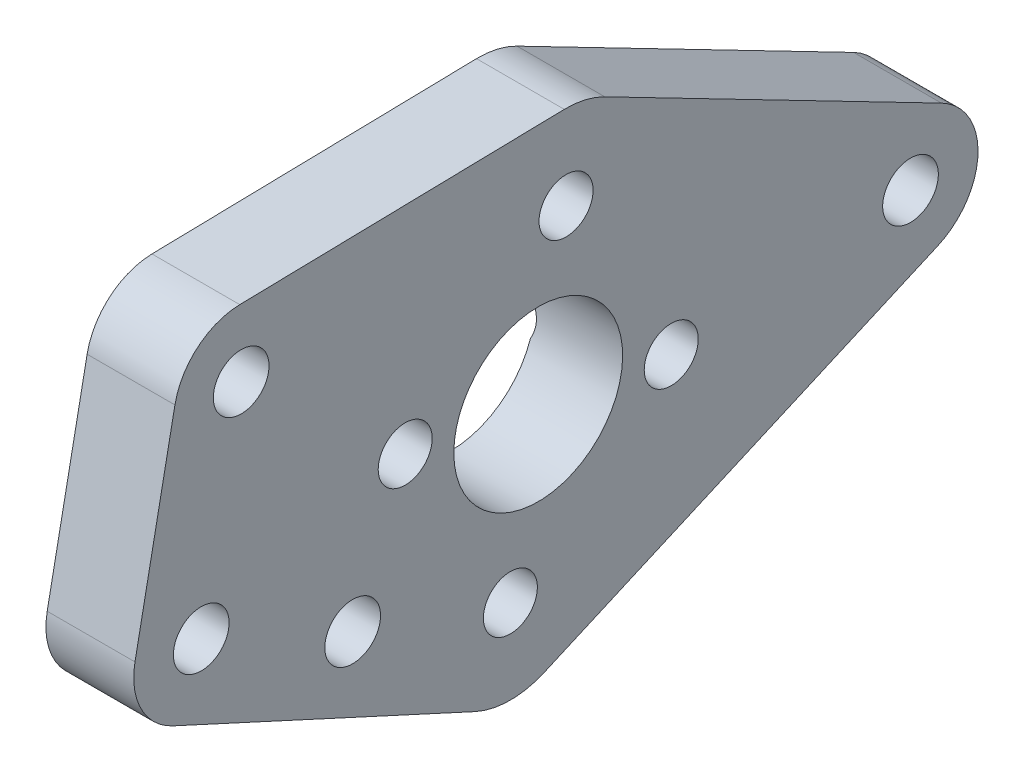
ISO-10303-21;
HEADER;
FILE_DESCRIPTION(('STEP AP214'),'2;1');
FILE_NAME('part.step','',(''),(''),'','','');
FILE_SCHEMA(('AUTOMOTIVE_DESIGN { 1 0 10303 214 1 1 1 1 }'));
ENDSEC;
DATA;
#1=APPLICATION_CONTEXT('core data for automotive mechanical design processes');
#2=APPLICATION_PROTOCOL_DEFINITION('international standard','automotive_design',2000,#1);
#3=PRODUCT_CONTEXT('',#1,'mechanical');
#4=PRODUCT('Part','Part','',(#3));
#5=PRODUCT_RELATED_PRODUCT_CATEGORY('part','',(#4));
#6=PRODUCT_DEFINITION_FORMATION('','',#4);
#7=PRODUCT_DEFINITION_CONTEXT('part definition',#1,'design');
#8=PRODUCT_DEFINITION('design','',#6,#7);
#9=PRODUCT_DEFINITION_SHAPE('','',#8);
#10=(LENGTH_UNIT() NAMED_UNIT(*) SI_UNIT(.MILLI.,.METRE.));
#11=(NAMED_UNIT(*) PLANE_ANGLE_UNIT() SI_UNIT($,.RADIAN.));
#12=(NAMED_UNIT(*) SI_UNIT($,.STERADIAN.) SOLID_ANGLE_UNIT());
#13=UNCERTAINTY_MEASURE_WITH_UNIT(LENGTH_MEASURE(1.E-05),#10,'distance_accuracy_value','');
#14=(GEOMETRIC_REPRESENTATION_CONTEXT(3) GLOBAL_UNCERTAINTY_ASSIGNED_CONTEXT((#13)) GLOBAL_UNIT_ASSIGNED_CONTEXT((#10,
#11,#12)) REPRESENTATION_CONTEXT('',''));
#15=CARTESIAN_POINT('',(0.,0.,0.));
#16=DIRECTION('',(0.,0.,1.));
#17=DIRECTION('',(1.,0.,0.));
#18=AXIS2_PLACEMENT_3D('',#15,#16,#17);
#19=CARTESIAN_POINT('',(-45.95,11.694326346384,29.6496576878358));
#20=DIRECTION('',(1.,0.,0.));
#21=DIRECTION('',(0.,0.,-1.));
#22=AXIS2_PLACEMENT_3D('',#19,#20,#21);
#23=PLANE('',#22);
#24=CARTESIAN_POINT('',(-45.95,11.694326346384,29.6496576878358));
#25=DIRECTION('',(-1.,0.,0.));
#26=DIRECTION('',(0.,0.,1.));
#27=AXIS2_PLACEMENT_3D('',#24,#25,#26);
#28=CIRCLE('',#27,3.15);
#29=CARTESIAN_POINT('',(-45.95,11.694326346384,32.7996576878358));
#30=VERTEX_POINT('',#29);
#31=EDGE_CURVE('E398',#30,#30,#28,.T.);
#32=ORIENTED_EDGE('',*,*,#31,.F.);
#33=EDGE_LOOP('',(#32));
#34=FACE_BOUND('',#33,.T.);
#35=CARTESIAN_POINT('',(-45.95,30.405673653616,26.3503423121642));
#36=DIRECTION('',(-1.,0.,0.));
#37=DIRECTION('',(0.,0.,1.));
#38=AXIS2_PLACEMENT_3D('',#35,#36,#37);
#39=CIRCLE('',#38,3.15);
#40=CARTESIAN_POINT('',(-45.95,30.405673653616,29.5003423121642));
#41=VERTEX_POINT('',#40);
#42=EDGE_CURVE('E386',#41,#41,#39,.T.);
#43=ORIENTED_EDGE('',*,*,#42,.F.);
#44=EDGE_LOOP('',(#43));
#45=FACE_BOUND('',#44,.T.);
#46=DIRECTION('',(0.,-0.401761786530703,0.915744214769418));
#47=VECTOR('',#46,1.);
#48=CARTESIAN_POINT('',(-45.95,17.3370231409223,4.34295285387717));
#49=LINE('',#48,#47);
#50=CARTESIAN_POINT('',(-45.95,17.3370231409223,4.34295285387717));
#51=VERTEX_POINT('',#50);
#52=CARTESIAN_POINT('',(-45.95,16.1478216498747,7.05352519333671));
#53=VERTEX_POINT('',#52);
#54=EDGE_CURVE('E153',#51,#53,#49,.T.);
#55=ORIENTED_EDGE('',*,*,#54,.T.);
#56=CARTESIAN_POINT('',(-45.95,16.8,11.));
#57=DIRECTION('',(-1.,0.,0.));
#58=DIRECTION('',(0.,0.,1.));
#59=AXIS2_PLACEMENT_3D('',#56,#57,#58);
#60=CIRCLE('',#59,4.);
#61=CARTESIAN_POINT('',(-45.95,13.4544579333103,13.1925665964823));
#62=VERTEX_POINT('',#61);
#63=EDGE_CURVE('E141',#62,#53,#60,.T.);
#64=ORIENTED_EDGE('',*,*,#63,.F.);
#65=CARTESIAN_POINT('',(-45.95,7.11560527253691,27.6408487551823));
#66=VERTEX_POINT('',#65);
#67=EDGE_CURVE('E160',#62,#66,#49,.T.);
#68=ORIENTED_EDGE('',*,*,#67,.T.);
#69=CARTESIAN_POINT('',(-45.95,11.694326346384,29.6496576878358));
#70=DIRECTION('',(-1.,0.,0.));
#71=DIRECTION('',(0.,0.,-1.));
#72=AXIS2_PLACEMENT_3D('',#69,#70,#71);
#73=CIRCLE('',#72,5.);
#74=CARTESIAN_POINT('',(-45.95,7.15033048960688,31.7358268213416));
#75=VERTEX_POINT('',#74);
#76=EDGE_CURVE('E189',#66,#75,#73,.T.);
#77=ORIENTED_EDGE('',*,*,#76,.T.);
#78=DIRECTION('',(0.,0.417233826701161,0.908799171355424));
#79=VECTOR('',#78,1.);
#80=CARTESIAN_POINT('',(-45.95,7.15033048960688,31.7358268213416));
#81=LINE('',#80,#79);
#82=CARTESIAN_POINT('',(-45.95,15.3648033145783,49.6282066302362));
#83=VERTEX_POINT('',#82);
#84=EDGE_CURVE('E344',#75,#83,#81,.T.);
#85=ORIENTED_EDGE('',*,*,#84,.T.);
#86=CARTESIAN_POINT('',(-45.95,19.,47.9592713234316));
#87=DIRECTION('',(-1.,0.,0.));
#88=DIRECTION('',(0.,0.,1.));
#89=AXIS2_PLACEMENT_3D('',#86,#87,#88);
#90=CIRCLE('',#89,4.);
#91=CARTESIAN_POINT('',(-45.95,19.7736510710335,51.8837412265253));
#92=VERTEX_POINT('',#91);
#93=EDGE_CURVE('E314',#83,#92,#90,.T.);
#94=ORIENTED_EDGE('',*,*,#93,.T.);
#95=DIRECTION('',(0.,0.981117475773438,-0.193412767758383));
#96=VECTOR('',#95,1.);
#97=CARTESIAN_POINT('',(-45.95,19.7736510710335,51.8837412265253));
#98=LINE('',#97,#96);
#99=CARTESIAN_POINT('',(-45.95,31.7736510710335,49.5181190962387));
#100=VERTEX_POINT('',#99);
#101=EDGE_CURVE('E326',#92,#100,#98,.T.);
#102=ORIENTED_EDGE('',*,*,#101,.T.);
#103=CARTESIAN_POINT('',(-45.95,31.,45.5936491931449));
#104=DIRECTION('',(-1.,0.,0.));
#105=DIRECTION('',(0.,0.,-1.));
#106=AXIS2_PLACEMENT_3D('',#103,#104,#105);
#107=CIRCLE('',#106,3.99999999999999);
#108=CARTESIAN_POINT('',(-45.95,34.9991104806124,45.6780018093201));
#109=VERTEX_POINT('',#108);
#110=EDGE_CURVE('E323',#100,#109,#107,.T.);
#111=ORIENTED_EDGE('',*,*,#110,.T.);
#112=DIRECTION('',(0.,0.021088154043782,-0.999777620153115));
#113=VECTOR('',#112,1.);
#114=CARTESIAN_POINT('',(-45.95,34.9991104806124,45.6780018093201));
#115=LINE('',#114,#113);
#116=CARTESIAN_POINT('',(-45.95,35.4045617543815,26.4557830823831));
#117=VERTEX_POINT('',#116);
#118=EDGE_CURVE('E325',#109,#117,#115,.T.);
#119=ORIENTED_EDGE('',*,*,#118,.T.);
#120=CARTESIAN_POINT('',(-45.95,30.405673653616,26.3503423121642));
#121=DIRECTION('',(-1.,0.,0.));
#122=DIRECTION('',(0.,0.,-1.));
#123=AXIS2_PLACEMENT_3D('',#120,#121,#122);
#124=CIRCLE('',#123,5.00000000000001);
#125=CARTESIAN_POINT('',(-45.95,34.8486130916121,24.0568102870338));
#126=VERTEX_POINT('',#125);
#127=EDGE_CURVE('E328',#117,#126,#124,.T.);
#128=ORIENTED_EDGE('',*,*,#127,.T.);
#129=DIRECTION('',(0.,-0.458706405026081,-0.888587887599223));
#130=VECTOR('',#129,1.);
#131=CARTESIAN_POINT('',(-45.95,34.8486130916121,24.0568102870338));
#132=LINE('',#131,#130);
#133=CARTESIAN_POINT('',(-45.95,24.5543515503969,4.11517437989566));
#134=VERTEX_POINT('',#133);
#135=EDGE_CURVE('E333',#126,#134,#132,.T.);
#136=ORIENTED_EDGE('',*,*,#135,.T.);
#137=CARTESIAN_POINT('',(-45.95,21.,5.94999999999998));
#138=DIRECTION('',(-1.,0.,0.));
#139=DIRECTION('',(0.,0.,1.));
#140=AXIS2_PLACEMENT_3D('',#137,#138,#139);
#141=CIRCLE('',#140,4.);
#142=EDGE_CURVE('E157',#134,#51,#141,.T.);
#143=ORIENTED_EDGE('',*,*,#142,.T.);
#144=EDGE_LOOP('',(#55,#64,#68,#77,#85,#94,#102,#111,#119,#128,#136,#143));
#145=FACE_BOUND('',#144,.T.);
#146=CARTESIAN_POINT('',(-45.95,31.,45.5936491931449));
#147=DIRECTION('',(-1.,0.,0.));
#148=DIRECTION('',(0.,0.,1.));
#149=AXIS2_PLACEMENT_3D('',#146,#147,#148);
#150=CIRCLE('',#149,1.65);
#151=CARTESIAN_POINT('',(-45.95,31.,47.2436491931449));
#152=VERTEX_POINT('',#151);
#153=EDGE_CURVE('E172',#152,#152,#150,.T.);
#154=ORIENTED_EDGE('',*,*,#153,.F.);
#155=EDGE_LOOP('',(#154));
#156=FACE_BOUND('',#155,.T.);
#157=CARTESIAN_POINT('',(-45.95,21.,5.94999999999998));
#158=DIRECTION('',(-1.,0.,0.));
#159=DIRECTION('',(0.,0.,1.));
#160=AXIS2_PLACEMENT_3D('',#157,#158,#159);
#161=CIRCLE('',#160,1.65);
#162=CARTESIAN_POINT('',(-45.95,21.,7.59999999999998));
#163=VERTEX_POINT('',#162);
#164=EDGE_CURVE('E351',#163,#163,#161,.T.);
#165=ORIENTED_EDGE('',*,*,#164,.F.);
#166=EDGE_LOOP('',(#165));
#167=FACE_BOUND('',#166,.T.);
#168=CARTESIAN_POINT('',(-45.95,19.,47.9592713234316));
#169=DIRECTION('',(-1.,0.,0.));
#170=DIRECTION('',(0.,0.,1.));
#171=AXIS2_PLACEMENT_3D('',#168,#169,#170);
#172=CIRCLE('',#171,1.65);
#173=CARTESIAN_POINT('',(-45.95,19.,49.6092713234316));
#174=VERTEX_POINT('',#173);
#175=EDGE_CURVE('E357',#174,#174,#172,.T.);
#176=ORIENTED_EDGE('',*,*,#175,.F.);
#177=EDGE_LOOP('',(#176));
#178=FACE_BOUND('',#177,.T.);
#179=CARTESIAN_POINT('',(-45.95,21.05,28.));
#180=DIRECTION('',(-1.,0.,0.));
#181=DIRECTION('',(0.,0.,1.));
#182=AXIS2_PLACEMENT_3D('',#179,#180,#181);
#183=CIRCLE('',#182,5.);
#184=CARTESIAN_POINT('',(-45.95,22.6538515498743,32.7357850675432));
#185=VERTEX_POINT('',#184);
#186=CARTESIAN_POINT('',(-45.95,20.9373935786923,23.0012681814404));
#187=VERTEX_POINT('',#186);
#188=EDGE_CURVE('E369',#185,#187,#183,.T.);
#189=ORIENTED_EDGE('',*,*,#188,.F.);
#190=CARTESIAN_POINT('',(-45.95,22.4391854213354,35.8784620240977));
#191=DIRECTION('',(-1.,0.,0.));
#192=DIRECTION('',(0.,0.,1.));
#193=AXIS2_PLACEMENT_3D('',#190,#191,#192);
#194=CIRCLE('',#193,3.15);
#195=CARTESIAN_POINT('',(-45.95,21.1626064213077,32.9987318185596));
#196=VERTEX_POINT('',#195);
#197=EDGE_CURVE('E62',#196,#185,#194,.T.);
#198=ORIENTED_EDGE('',*,*,#197,.F.);
#199=CARTESIAN_POINT('',(-45.95,19.4461484501256,23.2642149324567));
#200=VERTEX_POINT('',#199);
#201=EDGE_CURVE('E363',#200,#196,#183,.T.);
#202=ORIENTED_EDGE('',*,*,#201,.F.);
#203=CARTESIAN_POINT('',(-45.95,19.6608145786646,20.1215379759023));
#204=DIRECTION('',(-1.,0.,0.));
#205=DIRECTION('',(0.,0.,1.));
#206=AXIS2_PLACEMENT_3D('',#203,#204,#205);
#207=CIRCLE('',#206,3.15);
#208=EDGE_CURVE('E380',#187,#200,#207,.T.);
#209=ORIENTED_EDGE('',*,*,#208,.F.);
#210=EDGE_LOOP('',(#189,#198,#202,#209));
#211=FACE_BOUND('',#210,.T.);
#212=CARTESIAN_POINT('',(-45.95,14.882167407464,38.9900013160947));
#213=DIRECTION('',(-1.,0.,0.));
#214=DIRECTION('',(0.,0.,1.));
#215=AXIS2_PLACEMENT_3D('',#212,#213,#214);
#216=CIRCLE('',#215,1.65);
#217=CARTESIAN_POINT('',(-45.95,14.882167407464,40.6400013160947));
#218=VERTEX_POINT('',#217);
#219=EDGE_CURVE('E370',#218,#218,#216,.T.);
#220=ORIENTED_EDGE('',*,*,#219,.F.);
#221=EDGE_LOOP('',(#220));
#222=FACE_BOUND('',#221,.T.);
#223=ADVANCED_FACE('F41',(#34,#45,#145,#156,#167,#178,#211,#222),#23,.F.);
#224=CARTESIAN_POINT('',(-40.75,11.694326346384,29.6496576878358));
#225=DIRECTION('',(1.,0.,0.));
#226=DIRECTION('',(0.,0.,-1.));
#227=AXIS2_PLACEMENT_3D('',#224,#225,#226);
#228=PLANE('',#227);
#229=CARTESIAN_POINT('',(-40.75,11.694326346384,29.6496576878358));
#230=DIRECTION('',(1.,0.,0.));
#231=DIRECTION('',(0.,0.,-1.));
#232=AXIS2_PLACEMENT_3D('',#229,#230,#231);
#233=CIRCLE('',#232,1.59999999999999);
#234=CARTESIAN_POINT('',(-40.75,11.694326346384,28.0496576878358));
#235=VERTEX_POINT('',#234);
#236=EDGE_CURVE('E394',#235,#235,#233,.T.);
#237=ORIENTED_EDGE('',*,*,#236,.F.);
#238=EDGE_LOOP('',(#237));
#239=FACE_BOUND('',#238,.T.);
#240=CARTESIAN_POINT('',(-40.75,22.4391854213354,35.8784620240977));
#241=DIRECTION('',(1.,0.,0.));
#242=DIRECTION('',(0.,0.,-1.));
#243=AXIS2_PLACEMENT_3D('',#240,#241,#242);
#244=CIRCLE('',#243,1.59999999999999);
#245=CARTESIAN_POINT('',(-40.75,22.4391854213354,34.2784620240977));
#246=VERTEX_POINT('',#245);
#247=EDGE_CURVE('E389',#246,#246,#244,.T.);
#248=ORIENTED_EDGE('',*,*,#247,.F.);
#249=EDGE_LOOP('',(#248));
#250=FACE_BOUND('',#249,.T.);
#251=CARTESIAN_POINT('',(-40.75,30.405673653616,26.3503423121642));
#252=DIRECTION('',(1.,0.,0.));
#253=DIRECTION('',(0.,0.,-1.));
#254=AXIS2_PLACEMENT_3D('',#251,#252,#253);
#255=CIRCLE('',#254,1.59999999999999);
#256=CARTESIAN_POINT('',(-40.75,30.405673653616,24.7503423121642));
#257=VERTEX_POINT('',#256);
#258=EDGE_CURVE('E382',#257,#257,#255,.T.);
#259=ORIENTED_EDGE('',*,*,#258,.F.);
#260=EDGE_LOOP('',(#259));
#261=FACE_BOUND('',#260,.T.);
#262=CARTESIAN_POINT('',(-40.75,19.6608145786646,20.1215379759023));
#263=DIRECTION('',(1.,0.,0.));
#264=DIRECTION('',(0.,0.,-1.));
#265=AXIS2_PLACEMENT_3D('',#262,#263,#264);
#266=CIRCLE('',#265,1.59999999999999);
#267=CARTESIAN_POINT('',(-40.75,19.6608145786646,18.5215379759023));
#268=VERTEX_POINT('',#267);
#269=EDGE_CURVE('E226',#268,#268,#266,.T.);
#270=ORIENTED_EDGE('',*,*,#269,.F.);
#271=EDGE_LOOP('',(#270));
#272=FACE_BOUND('',#271,.T.);
#273=CARTESIAN_POINT('',(-40.75,21.05,28.));
#274=DIRECTION('',(-1.,0.,0.));
#275=DIRECTION('',(0.,0.,1.));
#276=AXIS2_PLACEMENT_3D('',#273,#274,#275);
#277=CIRCLE('',#276,5.);
#278=CARTESIAN_POINT('',(-40.75,21.05,33.));
#279=VERTEX_POINT('',#278);
#280=EDGE_CURVE('E366',#279,#279,#277,.T.);
#281=ORIENTED_EDGE('',*,*,#280,.T.);
#282=EDGE_LOOP('',(#281));
#283=FACE_BOUND('',#282,.T.);
#284=CARTESIAN_POINT('',(-40.75,21.,5.94999999999998));
#285=DIRECTION('',(-1.,0.,0.));
#286=DIRECTION('',(0.,0.,1.));
#287=AXIS2_PLACEMENT_3D('',#284,#285,#286);
#288=CIRCLE('',#287,1.65);
#289=CARTESIAN_POINT('',(-40.75,21.,7.59999999999998));
#290=VERTEX_POINT('',#289);
#291=EDGE_CURVE('E354',#290,#290,#288,.T.);
#292=ORIENTED_EDGE('',*,*,#291,.T.);
#293=EDGE_LOOP('',(#292));
#294=FACE_BOUND('',#293,.T.);
#295=CARTESIAN_POINT('',(-40.75,11.694326346384,29.6496576878358));
#296=DIRECTION('',(-1.,0.,0.));
#297=DIRECTION('',(0.,0.,-1.));
#298=AXIS2_PLACEMENT_3D('',#295,#296,#297);
#299=CIRCLE('',#298,5.);
#300=CARTESIAN_POINT('',(-40.75,7.11560527253691,27.6408487551823));
#301=VERTEX_POINT('',#300);
#302=CARTESIAN_POINT('',(-40.75,7.15033048960688,31.7358268213416));
#303=VERTEX_POINT('',#302);
#304=EDGE_CURVE('E168',#301,#303,#299,.T.);
#305=ORIENTED_EDGE('',*,*,#304,.F.);
#306=DIRECTION('',(0.,-0.401761786530703,0.915744214769418));
#307=VECTOR('',#306,1.);
#308=CARTESIAN_POINT('',(-40.75,17.3370231409223,4.34295285387717));
#309=LINE('',#308,#307);
#310=CARTESIAN_POINT('',(-40.75,17.3370231409223,4.34295285387717));
#311=VERTEX_POINT('',#310);
#312=EDGE_CURVE('E188',#311,#301,#309,.T.);
#313=ORIENTED_EDGE('',*,*,#312,.F.);
#314=CARTESIAN_POINT('',(-40.75,21.,5.94999999999998));
#315=DIRECTION('',(-1.,0.,0.));
#316=DIRECTION('',(0.,0.,1.));
#317=AXIS2_PLACEMENT_3D('',#314,#315,#316);
#318=CIRCLE('',#317,4.);
#319=CARTESIAN_POINT('',(-40.75,24.5543515503969,4.11517437989566));
#320=VERTEX_POINT('',#319);
#321=EDGE_CURVE('E186',#320,#311,#318,.T.);
#322=ORIENTED_EDGE('',*,*,#321,.F.);
#323=DIRECTION('',(0.,-0.458706405026081,-0.888587887599223));
#324=VECTOR('',#323,1.);
#325=CARTESIAN_POINT('',(-40.75,34.8486130916121,24.0568102870338));
#326=LINE('',#325,#324);
#327=CARTESIAN_POINT('',(-40.75,34.8486130916121,24.0568102870338));
#328=VERTEX_POINT('',#327);
#329=EDGE_CURVE('E184',#328,#320,#326,.T.);
#330=ORIENTED_EDGE('',*,*,#329,.F.);
#331=CARTESIAN_POINT('',(-40.75,30.405673653616,26.3503423121642));
#332=DIRECTION('',(-1.,0.,0.));
#333=DIRECTION('',(0.,0.,-1.));
#334=AXIS2_PLACEMENT_3D('',#331,#332,#333);
#335=CIRCLE('',#334,5.00000000000001);
#336=CARTESIAN_POINT('',(-40.75,35.4045617543815,26.4557830823831));
#337=VERTEX_POINT('',#336);
#338=EDGE_CURVE('E182',#337,#328,#335,.T.);
#339=ORIENTED_EDGE('',*,*,#338,.F.);
#340=DIRECTION('',(0.,0.021088154043782,-0.999777620153115));
#341=VECTOR('',#340,1.);
#342=CARTESIAN_POINT('',(-40.75,34.9991104806124,45.6780018093201));
#343=LINE('',#342,#341);
#344=CARTESIAN_POINT('',(-40.75,34.9991104806124,45.6780018093201));
#345=VERTEX_POINT('',#344);
#346=EDGE_CURVE('E180',#345,#337,#343,.T.);
#347=ORIENTED_EDGE('',*,*,#346,.F.);
#348=CARTESIAN_POINT('',(-40.75,31.,45.5936491931449));
#349=DIRECTION('',(-1.,0.,0.));
#350=DIRECTION('',(0.,0.,-1.));
#351=AXIS2_PLACEMENT_3D('',#348,#349,#350);
#352=CIRCLE('',#351,3.99999999999999);
#353=CARTESIAN_POINT('',(-40.75,31.7736510710335,49.5181190962387));
#354=VERTEX_POINT('',#353);
#355=EDGE_CURVE('E178',#354,#345,#352,.T.);
#356=ORIENTED_EDGE('',*,*,#355,.F.);
#357=DIRECTION('',(0.,0.981117475773438,-0.193412767758383));
#358=VECTOR('',#357,1.);
#359=CARTESIAN_POINT('',(-40.75,19.7736510710335,51.8837412265253));
#360=LINE('',#359,#358);
#361=CARTESIAN_POINT('',(-40.75,19.7736510710335,51.8837412265253));
#362=VERTEX_POINT('',#361);
#363=EDGE_CURVE('E176',#362,#354,#360,.T.);
#364=ORIENTED_EDGE('',*,*,#363,.F.);
#365=CARTESIAN_POINT('',(-40.75,19.,47.9592713234316));
#366=DIRECTION('',(-1.,0.,0.));
#367=DIRECTION('',(0.,0.,1.));
#368=AXIS2_PLACEMENT_3D('',#365,#366,#367);
#369=CIRCLE('',#368,4.);
#370=CARTESIAN_POINT('',(-40.75,15.3648033145783,49.6282066302362));
#371=VERTEX_POINT('',#370);
#372=EDGE_CURVE('E174',#371,#362,#369,.T.);
#373=ORIENTED_EDGE('',*,*,#372,.F.);
#374=DIRECTION('',(0.,0.417233826701161,0.908799171355424));
#375=VECTOR('',#374,1.);
#376=CARTESIAN_POINT('',(-40.75,7.15033048960688,31.7358268213416));
#377=LINE('',#376,#375);
#378=EDGE_CURVE('E171',#303,#371,#377,.T.);
#379=ORIENTED_EDGE('',*,*,#378,.F.);
#380=EDGE_LOOP('',(#305,#313,#322,#330,#339,#347,#356,#364,#373,#379));
#381=FACE_BOUND('',#380,.T.);
#382=CARTESIAN_POINT('',(-40.75,31.,45.5936491931449));
#383=DIRECTION('',(-1.,0.,0.));
#384=DIRECTION('',(0.,0.,1.));
#385=AXIS2_PLACEMENT_3D('',#382,#383,#384);
#386=CIRCLE('',#385,1.65);
#387=CARTESIAN_POINT('',(-40.75,31.,47.2436491931449));
#388=VERTEX_POINT('',#387);
#389=EDGE_CURVE('E348',#388,#388,#386,.T.);
#390=ORIENTED_EDGE('',*,*,#389,.T.);
#391=EDGE_LOOP('',(#390));
#392=FACE_BOUND('',#391,.T.);
#393=CARTESIAN_POINT('',(-40.75,19.,47.9592713234316));
#394=DIRECTION('',(-1.,0.,0.));
#395=DIRECTION('',(0.,0.,1.));
#396=AXIS2_PLACEMENT_3D('',#393,#394,#395);
#397=CIRCLE('',#396,1.65);
#398=CARTESIAN_POINT('',(-40.75,19.,49.6092713234316));
#399=VERTEX_POINT('',#398);
#400=EDGE_CURVE('E360',#399,#399,#397,.T.);
#401=ORIENTED_EDGE('',*,*,#400,.T.);
#402=EDGE_LOOP('',(#401));
#403=FACE_BOUND('',#402,.T.);
#404=CARTESIAN_POINT('',(-40.75,14.882167407464,38.9900013160947));
#405=DIRECTION('',(-1.,0.,0.));
#406=DIRECTION('',(0.,0.,1.));
#407=AXIS2_PLACEMENT_3D('',#404,#405,#406);
#408=CIRCLE('',#407,1.65);
#409=CARTESIAN_POINT('',(-40.75,14.882167407464,40.6400013160947));
#410=VERTEX_POINT('',#409);
#411=EDGE_CURVE('E373',#410,#410,#408,.T.);
#412=ORIENTED_EDGE('',*,*,#411,.T.);
#413=EDGE_LOOP('',(#412));
#414=FACE_BOUND('',#413,.T.);
#415=ADVANCED_FACE('F255',(#239,#250,#261,#272,#283,#294,#381,#392,#403,#414),#228,.T.);
#416=CARTESIAN_POINT('',(-45.95,11.694326346384,29.6496576878358));
#417=DIRECTION('',(1.,0.,0.));
#418=DIRECTION('',(0.,0.,-1.));
#419=AXIS2_PLACEMENT_3D('',#416,#417,#418);
#420=CYLINDRICAL_SURFACE('',#419,5.);
#421=ORIENTED_EDGE('',*,*,#304,.T.);
#422=DIRECTION('',(1.,0.,0.));
#423=VECTOR('',#422,1.);
#424=CARTESIAN_POINT('',(-45.95,7.15033048960688,31.7358268213416));
#425=LINE('',#424,#423);
#426=EDGE_CURVE('E213',#75,#303,#425,.T.);
#427=ORIENTED_EDGE('',*,*,#426,.F.);
#428=ORIENTED_EDGE('',*,*,#76,.F.);
#429=DIRECTION('',(1.,0.,0.));
#430=VECTOR('',#429,1.);
#431=CARTESIAN_POINT('',(-45.95,7.11560527253691,27.6408487551823));
#432=LINE('',#431,#430);
#433=EDGE_CURVE('E159',#66,#301,#432,.T.);
#434=ORIENTED_EDGE('',*,*,#433,.T.);
#435=EDGE_LOOP('',(#421,#427,#428,#434));
#436=FACE_BOUND('',#435,.T.);
#437=ADVANCED_FACE('F43',(#436),#420,.T.);
#438=CARTESIAN_POINT('',(-45.95,7.15033048960688,31.7358268213416));
#439=DIRECTION('',(0.,0.908799171355424,-0.417233826701161));
#440=DIRECTION('',(0.,0.417233826701161,0.908799171355424));
#441=AXIS2_PLACEMENT_3D('',#438,#439,#440);
#442=PLANE('',#441);
#443=ORIENTED_EDGE('',*,*,#378,.T.);
#444=DIRECTION('',(1.,0.,0.));
#445=VECTOR('',#444,1.);
#446=CARTESIAN_POINT('',(-45.95,15.3648033145783,49.6282066302362));
#447=LINE('',#446,#445);
#448=EDGE_CURVE('E210',#83,#371,#447,.T.);
#449=ORIENTED_EDGE('',*,*,#448,.F.);
#450=ORIENTED_EDGE('',*,*,#84,.F.);
#451=ORIENTED_EDGE('',*,*,#426,.T.);
#452=EDGE_LOOP('',(#443,#449,#450,#451));
#453=FACE_BOUND('',#452,.T.);
#454=ADVANCED_FACE('F298',(#453),#442,.F.);
#455=CARTESIAN_POINT('',(-45.95,19.,47.9592713234316));
#456=DIRECTION('',(1.,0.,0.));
#457=DIRECTION('',(0.,0.,-1.));
#458=AXIS2_PLACEMENT_3D('',#455,#456,#457);
#459=CYLINDRICAL_SURFACE('',#458,4.);
#460=ORIENTED_EDGE('',*,*,#372,.T.);
#461=DIRECTION('',(1.,0.,0.));
#462=VECTOR('',#461,1.);
#463=CARTESIAN_POINT('',(-45.95,19.7736510710335,51.8837412265253));
#464=LINE('',#463,#462);
#465=EDGE_CURVE('E207',#92,#362,#464,.T.);
#466=ORIENTED_EDGE('',*,*,#465,.F.);
#467=ORIENTED_EDGE('',*,*,#93,.F.);
#468=ORIENTED_EDGE('',*,*,#448,.T.);
#469=EDGE_LOOP('',(#460,#466,#467,#468));
#470=FACE_BOUND('',#469,.T.);
#471=ADVANCED_FACE('F295',(#470),#459,.T.);
#472=CARTESIAN_POINT('',(-45.95,19.7736510710335,51.8837412265253));
#473=DIRECTION('',(0.,-0.193412767758383,-0.981117475773437));
#474=DIRECTION('',(0.,0.981117475773438,-0.193412767758383));
#475=AXIS2_PLACEMENT_3D('',#472,#473,#474);
#476=PLANE('',#475);
#477=ORIENTED_EDGE('',*,*,#363,.T.);
#478=DIRECTION('',(1.,0.,0.));
#479=VECTOR('',#478,1.);
#480=CARTESIAN_POINT('',(-45.95,31.7736510710335,49.5181190962387));
#481=LINE('',#480,#479);
#482=EDGE_CURVE('E204',#100,#354,#481,.T.);
#483=ORIENTED_EDGE('',*,*,#482,.F.);
#484=ORIENTED_EDGE('',*,*,#101,.F.);
#485=ORIENTED_EDGE('',*,*,#465,.T.);
#486=EDGE_LOOP('',(#477,#483,#484,#485));
#487=FACE_BOUND('',#486,.T.);
#488=ADVANCED_FACE('F291',(#487),#476,.F.);
#489=CARTESIAN_POINT('',(-45.95,31.,45.5936491931449));
#490=DIRECTION('',(1.,0.,0.));
#491=DIRECTION('',(0.,0.,-1.));
#492=AXIS2_PLACEMENT_3D('',#489,#490,#491);
#493=CYLINDRICAL_SURFACE('',#492,3.99999999999999);
#494=ORIENTED_EDGE('',*,*,#355,.T.);
#495=DIRECTION('',(1.,0.,0.));
#496=VECTOR('',#495,1.);
#497=CARTESIAN_POINT('',(-45.95,34.9991104806124,45.6780018093201));
#498=LINE('',#497,#496);
#499=EDGE_CURVE('E201',#109,#345,#498,.T.);
#500=ORIENTED_EDGE('',*,*,#499,.F.);
#501=ORIENTED_EDGE('',*,*,#110,.F.);
#502=ORIENTED_EDGE('',*,*,#482,.T.);
#503=EDGE_LOOP('',(#494,#500,#501,#502));
#504=FACE_BOUND('',#503,.T.);
#505=ADVANCED_FACE('F287',(#504),#493,.T.);
#506=CARTESIAN_POINT('',(-45.95,34.9991104806124,45.6780018093201));
#507=DIRECTION('',(0.,-0.999777620153115,-0.021088154043782));
#508=DIRECTION('',(0.,0.021088154043782,-0.999777620153115));
#509=AXIS2_PLACEMENT_3D('',#506,#507,#508);
#510=PLANE('',#509);
#511=ORIENTED_EDGE('',*,*,#346,.T.);
#512=DIRECTION('',(1.,0.,0.));
#513=VECTOR('',#512,1.);
#514=CARTESIAN_POINT('',(-45.95,35.4045617543815,26.4557830823831));
#515=LINE('',#514,#513);
#516=EDGE_CURVE('E198',#117,#337,#515,.T.);
#517=ORIENTED_EDGE('',*,*,#516,.F.);
#518=ORIENTED_EDGE('',*,*,#118,.F.);
#519=ORIENTED_EDGE('',*,*,#499,.T.);
#520=EDGE_LOOP('',(#511,#517,#518,#519));
#521=FACE_BOUND('',#520,.T.);
#522=ADVANCED_FACE('F283',(#521),#510,.F.);
#523=CARTESIAN_POINT('',(-45.95,30.405673653616,26.3503423121642));
#524=DIRECTION('',(1.,0.,0.));
#525=DIRECTION('',(0.,0.,-1.));
#526=AXIS2_PLACEMENT_3D('',#523,#524,#525);
#527=CYLINDRICAL_SURFACE('',#526,5.00000000000001);
#528=ORIENTED_EDGE('',*,*,#338,.T.);
#529=DIRECTION('',(1.,0.,0.));
#530=VECTOR('',#529,1.);
#531=CARTESIAN_POINT('',(-45.95,34.8486130916121,24.0568102870338));
#532=LINE('',#531,#530);
#533=EDGE_CURVE('E195',#126,#328,#532,.T.);
#534=ORIENTED_EDGE('',*,*,#533,.F.);
#535=ORIENTED_EDGE('',*,*,#127,.F.);
#536=ORIENTED_EDGE('',*,*,#516,.T.);
#537=EDGE_LOOP('',(#528,#534,#535,#536));
#538=FACE_BOUND('',#537,.T.);
#539=ADVANCED_FACE('F279',(#538),#527,.T.);
#540=CARTESIAN_POINT('',(-45.95,34.8486130916121,24.0568102870338));
#541=DIRECTION('',(0.,-0.888587887599223,0.458706405026081));
#542=DIRECTION('',(0.,-0.458706405026081,-0.888587887599223));
#543=AXIS2_PLACEMENT_3D('',#540,#541,#542);
#544=PLANE('',#543);
#545=ORIENTED_EDGE('',*,*,#329,.T.);
#546=DIRECTION('',(1.,0.,0.));
#547=VECTOR('',#546,1.);
#548=CARTESIAN_POINT('',(-45.95,24.5543515503969,4.11517437989566));
#549=LINE('',#548,#547);
#550=EDGE_CURVE('E192',#134,#320,#549,.T.);
#551=ORIENTED_EDGE('',*,*,#550,.F.);
#552=ORIENTED_EDGE('',*,*,#135,.F.);
#553=ORIENTED_EDGE('',*,*,#533,.T.);
#554=EDGE_LOOP('',(#545,#551,#552,#553));
#555=FACE_BOUND('',#554,.T.);
#556=ADVANCED_FACE('F275',(#555),#544,.F.);
#557=CARTESIAN_POINT('',(-45.95,21.,5.94999999999998));
#558=DIRECTION('',(1.,0.,0.));
#559=DIRECTION('',(0.,0.,-1.));
#560=AXIS2_PLACEMENT_3D('',#557,#558,#559);
#561=CYLINDRICAL_SURFACE('',#560,4.);
#562=ORIENTED_EDGE('',*,*,#321,.T.);
#563=DIRECTION('',(1.,0.,0.));
#564=VECTOR('',#563,1.);
#565=CARTESIAN_POINT('',(-45.95,17.3370231409223,4.34295285387717));
#566=LINE('',#565,#564);
#567=EDGE_CURVE('E163',#51,#311,#566,.T.);
#568=ORIENTED_EDGE('',*,*,#567,.F.);
#569=ORIENTED_EDGE('',*,*,#142,.F.);
#570=ORIENTED_EDGE('',*,*,#550,.T.);
#571=EDGE_LOOP('',(#562,#568,#569,#570));
#572=FACE_BOUND('',#571,.T.);
#573=ADVANCED_FACE('F272',(#572),#561,.T.);
#574=CARTESIAN_POINT('',(-45.95,17.3370231409223,4.34295285387717));
#575=DIRECTION('',(0.,0.915744214769418,0.401761786530703));
#576=DIRECTION('',(0.,-0.401761786530703,0.915744214769418));
#577=AXIS2_PLACEMENT_3D('',#574,#575,#576);
#578=PLANE('',#577);
#579=DIRECTION('',(0.,-0.401761786530703,0.915744214769418));
#580=VECTOR('',#579,1.);
#581=CARTESIAN_POINT('',(-43.25,17.3370231409223,4.34295285387717));
#582=LINE('',#581,#580);
#583=CARTESIAN_POINT('',(-43.25,16.1478216498747,7.05352519333671));
#584=VERTEX_POINT('',#583);
#585=CARTESIAN_POINT('',(-43.25,13.4544579333103,13.1925665964823));
#586=VERTEX_POINT('',#585);
#587=EDGE_CURVE('E154',#584,#586,#582,.T.);
#588=ORIENTED_EDGE('',*,*,#587,.F.);
#589=DIRECTION('',(-1.,0.,0.));
#590=VECTOR('',#589,1.);
#591=CARTESIAN_POINT('',(-43.25,16.1478216498747,7.05352519333671));
#592=LINE('',#591,#590);
#593=EDGE_CURVE('E11',#584,#53,#592,.T.);
#594=ORIENTED_EDGE('',*,*,#593,.T.);
#595=ORIENTED_EDGE('',*,*,#54,.F.);
#596=ORIENTED_EDGE('',*,*,#567,.T.);
#597=ORIENTED_EDGE('',*,*,#312,.T.);
#598=ORIENTED_EDGE('',*,*,#433,.F.);
#599=ORIENTED_EDGE('',*,*,#67,.F.);
#600=DIRECTION('',(-1.,0.,0.));
#601=VECTOR('',#600,1.);
#602=CARTESIAN_POINT('',(-43.25,13.4544579333103,13.1925665964823));
#603=LINE('',#602,#601);
#604=EDGE_CURVE('E49',#62,#586,#603,.F.);
#605=ORIENTED_EDGE('',*,*,#604,.T.);
#606=EDGE_LOOP('',(#588,#594,#595,#596,#597,#598,#599,#605));
#607=FACE_BOUND('',#606,.T.);
#608=ADVANCED_FACE('F151',(#607),#578,.F.);
#609=CARTESIAN_POINT('',(-45.95,31.,45.5936491931449));
#610=DIRECTION('',(1.,0.,0.));
#611=DIRECTION('',(0.,0.,-1.));
#612=AXIS2_PLACEMENT_3D('',#609,#610,#611);
#613=CYLINDRICAL_SURFACE('',#612,1.65);
#614=ORIENTED_EDGE('',*,*,#153,.T.);
#615=EDGE_LOOP('',(#614));
#616=FACE_BOUND('',#615,.T.);
#617=ORIENTED_EDGE('',*,*,#389,.F.);
#618=EDGE_LOOP('',(#617));
#619=FACE_BOUND('',#618,.T.);
#620=ADVANCED_FACE('F267',(#616,#619),#613,.F.);
#621=CARTESIAN_POINT('',(-45.95,21.,5.94999999999998));
#622=DIRECTION('',(1.,0.,0.));
#623=DIRECTION('',(0.,0.,-1.));
#624=AXIS2_PLACEMENT_3D('',#621,#622,#623);
#625=CYLINDRICAL_SURFACE('',#624,1.65);
#626=ORIENTED_EDGE('',*,*,#164,.T.);
#627=EDGE_LOOP('',(#626));
#628=FACE_BOUND('',#627,.T.);
#629=ORIENTED_EDGE('',*,*,#291,.F.);
#630=EDGE_LOOP('',(#629));
#631=FACE_BOUND('',#630,.T.);
#632=ADVANCED_FACE('F589',(#628,#631),#625,.F.);
#633=CARTESIAN_POINT('',(-45.95,19.,47.9592713234316));
#634=DIRECTION('',(1.,0.,0.));
#635=DIRECTION('',(0.,0.,-1.));
#636=AXIS2_PLACEMENT_3D('',#633,#634,#635);
#637=CYLINDRICAL_SURFACE('',#636,1.65);
#638=ORIENTED_EDGE('',*,*,#175,.T.);
#639=EDGE_LOOP('',(#638));
#640=FACE_BOUND('',#639,.T.);
#641=ORIENTED_EDGE('',*,*,#400,.F.);
#642=EDGE_LOOP('',(#641));
#643=FACE_BOUND('',#642,.T.);
#644=ADVANCED_FACE('F250',(#640,#643),#637,.F.);
#645=CARTESIAN_POINT('',(-45.95,21.05,28.));
#646=DIRECTION('',(1.,0.,0.));
#647=DIRECTION('',(0.,0.,-1.));
#648=AXIS2_PLACEMENT_3D('',#645,#646,#647);
#649=CYLINDRICAL_SURFACE('',#648,5.);
#650=CARTESIAN_POINT('',(-45.9502,22.6543439676678,32.7356182736162));
#651=CARTESIAN_POINT('',(-45.9307296276941,22.6064428195904,32.751849359724));
#652=CARTESIAN_POINT('',(-45.9127819515984,22.5577055167029,32.7675474592011));
#653=CARTESIAN_POINT('',(-45.8803824635648,22.4586442616083,32.7977493977759));
#654=CARTESIAN_POINT('',(-45.8659356646758,22.408318149435,32.8122515049231));
#655=CARTESIAN_POINT('',(-45.8410888193217,22.3064754815464,32.8398391649618));
#656=CARTESIAN_POINT('',(-45.8306751926445,22.2549635505518,32.8529293625745));
#657=CARTESIAN_POINT('',(-45.8142272382686,22.1509106177011,32.8775867759233));
#658=CARTESIAN_POINT('',(-45.8081905534891,22.0983701853959,32.8891548086278));
#659=CARTESIAN_POINT('',(-45.8007206885968,21.9922000990567,32.9107242757772));
#660=CARTESIAN_POINT('',(-45.7993243060593,21.9385651162963,32.9207125923505));
#661=CARTESIAN_POINT('',(-45.8012891494893,21.8310757425406,32.9389171883073));
#662=CARTESIAN_POINT('',(-45.8046524833432,21.7772212648735,32.9471326807212));
#663=CARTESIAN_POINT('',(-45.8217117500843,21.6161330381507,32.9690207735099));
#664=CARTESIAN_POINT('',(-45.8423637537859,21.509177089157,32.9799748982791));
#665=CARTESIAN_POINT('',(-45.8817625478843,21.3632279699373,32.9903514541648));
#666=CARTESIAN_POINT('',(-45.8940191492861,21.3224893588511,32.9927347072294));
#667=CARTESIAN_POINT('',(-45.920610073262,21.241754364064,32.9964833722301));
#668=CARTESIAN_POINT('',(-45.9349393516555,21.2017564369865,32.9978512071578));
#669=CARTESIAN_POINT('',(-45.9502,21.162086653058,32.9987435003415));
#670=B_SPLINE_CURVE_WITH_KNOTS('',3,(#650,#651,#652,#653,#654,#655,#656,#657,#658,#659,#660,
#661,#662,#663,#664,#665,#666,#667,#668,#669),.UNSPECIFIED.,.F.,.F.,(4,2,2,2,2,2,2,2,2,4),(0.,
0.162602456734595,0.325436392645662,0.487717177367291,0.649910505229465,0.813386994571741,
0.976935903714061,1.30343731323307,1.4312254062432,1.55870758229932),.UNSPECIFIED.);
#671=EDGE_CURVE('E225',#185,#196,#670,.T.);
#672=ORIENTED_EDGE('',*,*,#671,.F.);
#673=ORIENTED_EDGE('',*,*,#188,.T.);
#674=CARTESIAN_POINT('',(-45.9502,19.4456560323322,23.2643817263838));
#675=CARTESIAN_POINT('',(-45.9307296276941,19.4935571804095,23.248150640276));
#676=CARTESIAN_POINT('',(-45.9127819515984,19.5422944832971,23.2324525407989));
#677=CARTESIAN_POINT('',(-45.8803824635648,19.6413557383917,23.202250602224));
#678=CARTESIAN_POINT('',(-45.8659356646758,19.6916818505649,23.1877484950769));
#679=CARTESIAN_POINT('',(-45.8410888193217,19.7935245184536,23.1601608350381));
#680=CARTESIAN_POINT('',(-45.8306751926445,19.8450364494481,23.1470706374255));
#681=CARTESIAN_POINT('',(-45.8142272382686,19.9490893822989,23.1224132240767));
#682=CARTESIAN_POINT('',(-45.8081905534891,20.0016298146041,23.1108451913722));
#683=CARTESIAN_POINT('',(-45.8007206885968,20.1077999009433,23.0892757242228));
#684=CARTESIAN_POINT('',(-45.7993243060593,20.1614348837037,23.0792874076495));
#685=CARTESIAN_POINT('',(-45.8012891494893,20.2689242574594,23.0610828116927));
#686=CARTESIAN_POINT('',(-45.8046524833432,20.3227787351265,23.0528673192788));
#687=CARTESIAN_POINT('',(-45.8217117500843,20.4838669618493,23.03097922649));
#688=CARTESIAN_POINT('',(-45.8423637537859,20.590822910843,23.0200251017209));
#689=CARTESIAN_POINT('',(-45.8817625478843,20.7367720300626,23.0096485458352));
#690=CARTESIAN_POINT('',(-45.8940191492861,20.7775106411489,23.0072652927706));
#691=CARTESIAN_POINT('',(-45.920610073262,20.858245635936,23.0035166277699));
#692=CARTESIAN_POINT('',(-45.9349393516555,20.8982435630134,23.0021487928422));
#693=CARTESIAN_POINT('',(-45.9502,20.9379133469419,23.0012564996585));
#694=B_SPLINE_CURVE_WITH_KNOTS('',3,(#674,#675,#676,#677,#678,#679,#680,#681,#682,#683,#684,
#685,#686,#687,#688,#689,#690,#691,#692,#693),.UNSPECIFIED.,.F.,.F.,(4,2,2,2,2,2,2,2,2,4),(0.,
0.162602456734597,0.325436392645661,0.487717177367293,0.649910505229467,0.813386994571742,
0.976935903714066,1.30343731323307,1.43122540624319,1.5587075822993),.UNSPECIFIED.);
#695=EDGE_CURVE('E216',#200,#187,#694,.T.);
#696=ORIENTED_EDGE('',*,*,#695,.F.);
#697=ORIENTED_EDGE('',*,*,#201,.T.);
#698=EDGE_LOOP('',(#672,#673,#696,#697));
#699=FACE_BOUND('',#698,.T.);
#700=ORIENTED_EDGE('',*,*,#280,.F.);
#701=EDGE_LOOP('',(#700));
#702=FACE_BOUND('',#701,.T.);
#703=ADVANCED_FACE('F228',(#699,#702),#649,.F.);
#704=CARTESIAN_POINT('',(-45.95,14.882167407464,38.9900013160947));
#705=DIRECTION('',(1.,0.,0.));
#706=DIRECTION('',(0.,0.,-1.));
#707=AXIS2_PLACEMENT_3D('',#704,#705,#706);
#708=CYLINDRICAL_SURFACE('',#707,1.65);
#709=ORIENTED_EDGE('',*,*,#219,.T.);
#710=EDGE_LOOP('',(#709));
#711=FACE_BOUND('',#710,.T.);
#712=ORIENTED_EDGE('',*,*,#411,.F.);
#713=EDGE_LOOP('',(#712));
#714=FACE_BOUND('',#713,.T.);
#715=ADVANCED_FACE('F242',(#711,#714),#708,.F.);
#716=CARTESIAN_POINT('',(-45.95,19.6608145786646,20.1215379759023));
#717=DIRECTION('',(-1.,0.,0.));
#718=DIRECTION('',(0.,0.,1.));
#719=AXIS2_PLACEMENT_3D('',#716,#717,#718);
#720=CYLINDRICAL_SURFACE('',#719,1.59999999999999);
#721=ORIENTED_EDGE('',*,*,#269,.T.);
#722=EDGE_LOOP('',(#721));
#723=FACE_BOUND('',#722,.T.);
#724=CARTESIAN_POINT('',(-44.4,19.6608145786646,20.1215379759023));
#725=DIRECTION('',(-1.,0.,0.));
#726=DIRECTION('',(0.,0.,1.));
#727=AXIS2_PLACEMENT_3D('',#724,#725,#726);
#728=CIRCLE('',#727,1.59999999999999);
#729=CARTESIAN_POINT('',(-44.4,19.6608145786646,21.7215379759023));
#730=VERTEX_POINT('',#729);
#731=EDGE_CURVE('E377',#730,#730,#728,.T.);
#732=ORIENTED_EDGE('',*,*,#731,.T.);
#733=EDGE_LOOP('',(#732));
#734=FACE_BOUND('',#733,.T.);
#735=ADVANCED_FACE('F238',(#723,#734),#720,.F.);
#736=CARTESIAN_POINT('',(-45.95,19.6608145786646,20.1215379759023));
#737=DIRECTION('',(-1.,0.,0.));
#738=DIRECTION('',(0.,0.,1.));
#739=AXIS2_PLACEMENT_3D('',#736,#737,#738);
#740=CONICAL_SURFACE('',#739,3.15,0.785398163397448);
#741=ORIENTED_EDGE('',*,*,#695,.T.);
#742=ORIENTED_EDGE('',*,*,#208,.T.);
#743=EDGE_LOOP('',(#741,#742));
#744=FACE_BOUND('',#743,.T.);
#745=ORIENTED_EDGE('',*,*,#731,.F.);
#746=EDGE_LOOP('',(#745));
#747=FACE_BOUND('',#746,.T.);
#748=ADVANCED_FACE('F232',(#744,#747),#740,.F.);
#749=CARTESIAN_POINT('',(-45.95,30.405673653616,26.3503423121642));
#750=DIRECTION('',(-1.,0.,0.));
#751=DIRECTION('',(0.,0.,1.));
#752=AXIS2_PLACEMENT_3D('',#749,#750,#751);
#753=CYLINDRICAL_SURFACE('',#752,1.59999999999999);
#754=ORIENTED_EDGE('',*,*,#258,.T.);
#755=EDGE_LOOP('',(#754));
#756=FACE_BOUND('',#755,.T.);
#757=CARTESIAN_POINT('',(-44.4,30.405673653616,26.3503423121642));
#758=DIRECTION('',(-1.,0.,0.));
#759=DIRECTION('',(0.,0.,1.));
#760=AXIS2_PLACEMENT_3D('',#757,#758,#759);
#761=CIRCLE('',#760,1.59999999999999);
#762=CARTESIAN_POINT('',(-44.4,30.405673653616,27.9503423121642));
#763=VERTEX_POINT('',#762);
#764=EDGE_CURVE('E383',#763,#763,#761,.T.);
#765=ORIENTED_EDGE('',*,*,#764,.T.);
#766=EDGE_LOOP('',(#765));
#767=FACE_BOUND('',#766,.T.);
#768=ADVANCED_FACE('F237',(#756,#767),#753,.F.);
#769=CARTESIAN_POINT('',(-45.95,30.405673653616,26.3503423121642));
#770=DIRECTION('',(-1.,0.,0.));
#771=DIRECTION('',(0.,0.,1.));
#772=AXIS2_PLACEMENT_3D('',#769,#770,#771);
#773=CONICAL_SURFACE('',#772,3.15,0.785398163397448);
#774=ORIENTED_EDGE('',*,*,#764,.F.);
#775=EDGE_LOOP('',(#774));
#776=FACE_BOUND('',#775,.T.);
#777=ORIENTED_EDGE('',*,*,#42,.T.);
#778=EDGE_LOOP('',(#777));
#779=FACE_BOUND('',#778,.T.);
#780=ADVANCED_FACE('F470',(#776,#779),#773,.F.);
#781=CARTESIAN_POINT('',(-45.95,22.4391854213354,35.8784620240977));
#782=DIRECTION('',(-1.,0.,0.));
#783=DIRECTION('',(0.,0.,1.));
#784=AXIS2_PLACEMENT_3D('',#781,#782,#783);
#785=CYLINDRICAL_SURFACE('',#784,1.59999999999999);
#786=ORIENTED_EDGE('',*,*,#247,.T.);
#787=EDGE_LOOP('',(#786));
#788=FACE_BOUND('',#787,.T.);
#789=CARTESIAN_POINT('',(-44.4,22.4391854213354,35.8784620240977));
#790=DIRECTION('',(-1.,0.,0.));
#791=DIRECTION('',(0.,0.,1.));
#792=AXIS2_PLACEMENT_3D('',#789,#790,#791);
#793=CIRCLE('',#792,1.59999999999999);
#794=CARTESIAN_POINT('',(-44.4,22.4391854213354,37.4784620240976));
#795=VERTEX_POINT('',#794);
#796=EDGE_CURVE('E390',#795,#795,#793,.T.);
#797=ORIENTED_EDGE('',*,*,#796,.T.);
#798=EDGE_LOOP('',(#797));
#799=FACE_BOUND('',#798,.T.);
#800=ADVANCED_FACE('F423',(#788,#799),#785,.F.);
#801=CARTESIAN_POINT('',(-45.95,22.4391854213354,35.8784620240977));
#802=DIRECTION('',(-1.,0.,0.));
#803=DIRECTION('',(0.,0.,1.));
#804=AXIS2_PLACEMENT_3D('',#801,#802,#803);
#805=CONICAL_SURFACE('',#804,3.15,0.785398163397448);
#806=ORIENTED_EDGE('',*,*,#671,.T.);
#807=ORIENTED_EDGE('',*,*,#197,.T.);
#808=EDGE_LOOP('',(#806,#807));
#809=FACE_BOUND('',#808,.T.);
#810=ORIENTED_EDGE('',*,*,#796,.F.);
#811=EDGE_LOOP('',(#810));
#812=FACE_BOUND('',#811,.T.);
#813=ADVANCED_FACE('F414',(#809,#812),#805,.F.);
#814=CARTESIAN_POINT('',(-45.95,11.694326346384,29.6496576878358));
#815=DIRECTION('',(-1.,0.,0.));
#816=DIRECTION('',(0.,0.,1.));
#817=AXIS2_PLACEMENT_3D('',#814,#815,#816);
#818=CYLINDRICAL_SURFACE('',#817,1.59999999999999);
#819=ORIENTED_EDGE('',*,*,#236,.T.);
#820=EDGE_LOOP('',(#819));
#821=FACE_BOUND('',#820,.T.);
#822=CARTESIAN_POINT('',(-44.4,11.694326346384,29.6496576878358));
#823=DIRECTION('',(-1.,0.,0.));
#824=DIRECTION('',(0.,0.,1.));
#825=AXIS2_PLACEMENT_3D('',#822,#823,#824);
#826=CIRCLE('',#825,1.59999999999999);
#827=CARTESIAN_POINT('',(-44.4,11.694326346384,31.2496576878358));
#828=VERTEX_POINT('',#827);
#829=EDGE_CURVE('E395',#828,#828,#826,.T.);
#830=ORIENTED_EDGE('',*,*,#829,.T.);
#831=EDGE_LOOP('',(#830));
#832=FACE_BOUND('',#831,.T.);
#833=ADVANCED_FACE('F404',(#821,#832),#818,.F.);
#834=CARTESIAN_POINT('',(-45.95,11.694326346384,29.6496576878358));
#835=DIRECTION('',(-1.,0.,0.));
#836=DIRECTION('',(0.,0.,1.));
#837=AXIS2_PLACEMENT_3D('',#834,#835,#836);
#838=CONICAL_SURFACE('',#837,3.15,0.785398163397448);
#839=ORIENTED_EDGE('',*,*,#829,.F.);
#840=EDGE_LOOP('',(#839));
#841=FACE_BOUND('',#840,.T.);
#842=ORIENTED_EDGE('',*,*,#31,.T.);
#843=EDGE_LOOP('',(#842));
#844=FACE_BOUND('',#843,.T.);
#845=ADVANCED_FACE('F402',(#841,#844),#838,.F.);
#846=CARTESIAN_POINT('',(-43.25,16.8,11.));
#847=DIRECTION('',(-1.,0.,0.));
#848=DIRECTION('',(0.,0.,1.));
#849=AXIS2_PLACEMENT_3D('',#846,#847,#848);
#850=CYLINDRICAL_SURFACE('',#849,4.);
#851=CARTESIAN_POINT('',(-43.25,16.8,11.));
#852=DIRECTION('',(-1.,0.,0.));
#853=DIRECTION('',(0.,0.,1.));
#854=AXIS2_PLACEMENT_3D('',#851,#852,#853);
#855=CIRCLE('',#854,4.);
#856=EDGE_CURVE('E55',#586,#584,#855,.T.);
#857=ORIENTED_EDGE('',*,*,#856,.F.);
#858=ORIENTED_EDGE('',*,*,#604,.F.);
#859=ORIENTED_EDGE('',*,*,#63,.T.);
#860=ORIENTED_EDGE('',*,*,#593,.F.);
#861=EDGE_LOOP('',(#857,#858,#859,#860));
#862=FACE_BOUND('',#861,.T.);
#863=ADVANCED_FACE('F142',(#862),#850,.F.);
#864=CARTESIAN_POINT('',(-43.25,16.8,11.));
#865=DIRECTION('',(-1.,0.,0.));
#866=DIRECTION('',(0.,0.,1.));
#867=AXIS2_PLACEMENT_3D('',#864,#865,#866);
#868=PLANE('',#867);
#869=ORIENTED_EDGE('',*,*,#587,.T.);
#870=ORIENTED_EDGE('',*,*,#856,.T.);
#871=EDGE_LOOP('',(#869,#870));
#872=FACE_BOUND('',#871,.T.);
#873=ADVANCED_FACE('F412',(#872),#868,.T.);
#874=CLOSED_SHELL('',(#223,#415,#437,#454,#471,#488,#505,#522,#539,#556,#573,#608,#620,#632,
#644,#703,#715,#735,#748,#768,#780,#800,#813,#833,#845,#863,#873));
#875=MANIFOLD_SOLID_BREP('B2',#874);
#876=ADVANCED_BREP_SHAPE_REPRESENTATION('',(#18,#875),#14);
#877=SHAPE_DEFINITION_REPRESENTATION(#9,#876);
ENDSEC;
END-ISO-10303-21;
